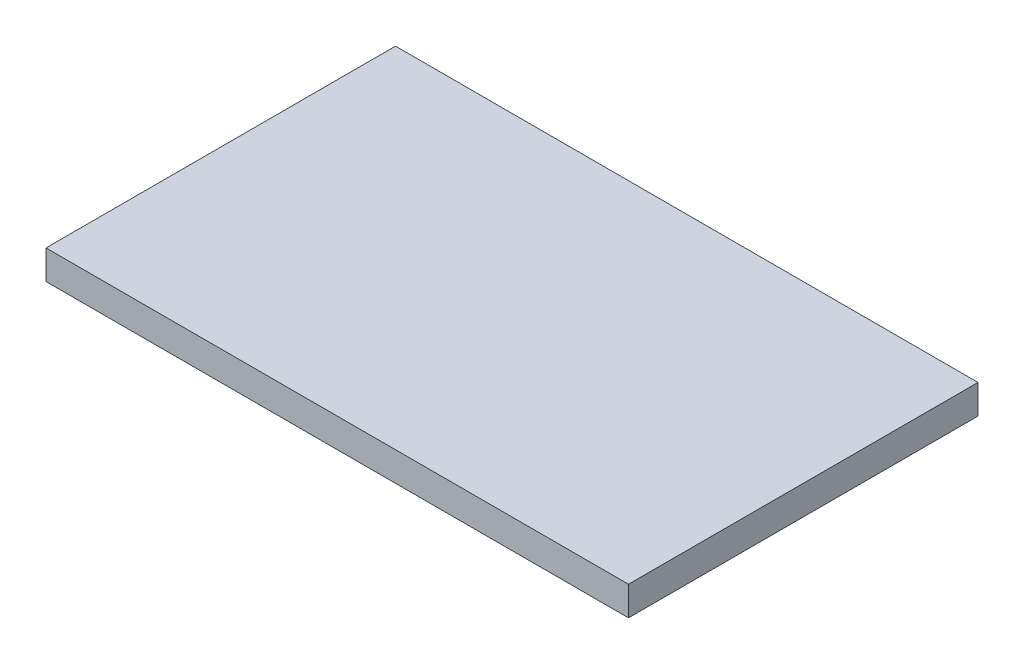
ISO-10303-21;
HEADER;
FILE_DESCRIPTION(('STEP AP214'),'2;1');
FILE_NAME('part.step','',(''),(''),'','','');
FILE_SCHEMA(('AUTOMOTIVE_DESIGN { 1 0 10303 214 1 1 1 1 }'));
ENDSEC;
DATA;
#1=APPLICATION_CONTEXT('core data for automotive mechanical design processes');
#2=APPLICATION_PROTOCOL_DEFINITION('international standard','automotive_design',2000,#1);
#3=PRODUCT_CONTEXT('',#1,'mechanical');
#4=PRODUCT('Part','Part','',(#3));
#5=PRODUCT_RELATED_PRODUCT_CATEGORY('part','',(#4));
#6=PRODUCT_DEFINITION_FORMATION('','',#4);
#7=PRODUCT_DEFINITION_CONTEXT('part definition',#1,'design');
#8=PRODUCT_DEFINITION('design','',#6,#7);
#9=PRODUCT_DEFINITION_SHAPE('','',#8);
#10=(LENGTH_UNIT() NAMED_UNIT(*) SI_UNIT(.MILLI.,.METRE.));
#11=(NAMED_UNIT(*) PLANE_ANGLE_UNIT() SI_UNIT($,.RADIAN.));
#12=(NAMED_UNIT(*) SI_UNIT($,.STERADIAN.) SOLID_ANGLE_UNIT());
#13=UNCERTAINTY_MEASURE_WITH_UNIT(LENGTH_MEASURE(1.E-05),#10,'distance_accuracy_value','');
#14=(GEOMETRIC_REPRESENTATION_CONTEXT(3) GLOBAL_UNCERTAINTY_ASSIGNED_CONTEXT((#13)) GLOBAL_UNIT_ASSIGNED_CONTEXT((#10,
#11,#12)) REPRESENTATION_CONTEXT('',''));
#15=CARTESIAN_POINT('',(0.,0.,0.));
#16=DIRECTION('',(0.,0.,1.));
#17=DIRECTION('',(1.,0.,0.));
#18=AXIS2_PLACEMENT_3D('',#15,#16,#17);
#19=CARTESIAN_POINT('',(254.,25.4,152.4));
#20=DIRECTION('',(-1.,0.,0.));
#21=DIRECTION('',(0.,0.,1.));
#22=AXIS2_PLACEMENT_3D('',#19,#20,#21);
#23=PLANE('',#22);
#24=DIRECTION('',(0.,0.,-1.));
#25=VECTOR('',#24,1.);
#26=CARTESIAN_POINT('',(254.,0.,152.4));
#27=LINE('',#26,#25);
#28=CARTESIAN_POINT('',(254.,0.,152.4));
#29=VERTEX_POINT('',#28);
#30=CARTESIAN_POINT('',(254.,0.,-152.4));
#31=VERTEX_POINT('',#30);
#32=EDGE_CURVE('E96',#29,#31,#27,.T.);
#33=ORIENTED_EDGE('',*,*,#32,.T.);
#34=DIRECTION('',(0.,-1.,0.));
#35=VECTOR('',#34,1.);
#36=CARTESIAN_POINT('',(254.,25.4,-152.4));
#37=LINE('',#36,#35);
#38=CARTESIAN_POINT('',(254.,25.4,-152.4));
#39=VERTEX_POINT('',#38);
#40=EDGE_CURVE('E11',#39,#31,#37,.T.);
#41=ORIENTED_EDGE('',*,*,#40,.F.);
#42=DIRECTION('',(0.,0.,-1.));
#43=VECTOR('',#42,1.);
#44=CARTESIAN_POINT('',(254.,25.4,152.4));
#45=LINE('',#44,#43);
#46=CARTESIAN_POINT('',(254.,25.4,152.4));
#47=VERTEX_POINT('',#46);
#48=EDGE_CURVE('E84',#47,#39,#45,.T.);
#49=ORIENTED_EDGE('',*,*,#48,.F.);
#50=DIRECTION('',(0.,-1.,0.));
#51=VECTOR('',#50,1.);
#52=CARTESIAN_POINT('',(254.,25.4,152.4));
#53=LINE('',#52,#51);
#54=EDGE_CURVE('E92',#47,#29,#53,.T.);
#55=ORIENTED_EDGE('',*,*,#54,.T.);
#56=EDGE_LOOP('',(#33,#41,#49,#55));
#57=FACE_BOUND('',#56,.T.);
#58=ADVANCED_FACE('F33',(#57),#23,.F.);
#59=CARTESIAN_POINT('',(-254.,25.4,-152.4));
#60=DIRECTION('',(0.,0.,1.));
#61=DIRECTION('',(1.,0.,0.));
#62=AXIS2_PLACEMENT_3D('',#59,#60,#61);
#63=PLANE('',#62);
#64=DIRECTION('',(-1.,0.,0.));
#65=VECTOR('',#64,1.);
#66=CARTESIAN_POINT('',(-254.,0.,-152.4));
#67=LINE('',#66,#65);
#68=CARTESIAN_POINT('',(-254.,0.,-152.4));
#69=VERTEX_POINT('',#68);
#70=EDGE_CURVE('E88',#31,#69,#67,.T.);
#71=ORIENTED_EDGE('',*,*,#70,.T.);
#72=DIRECTION('',(0.,-1.,0.));
#73=VECTOR('',#72,1.);
#74=CARTESIAN_POINT('',(-254.,25.4,-152.4));
#75=LINE('',#74,#73);
#76=CARTESIAN_POINT('',(-254.,25.4,-152.4));
#77=VERTEX_POINT('',#76);
#78=EDGE_CURVE('E41',#77,#69,#75,.T.);
#79=ORIENTED_EDGE('',*,*,#78,.F.);
#80=DIRECTION('',(-1.,0.,0.));
#81=VECTOR('',#80,1.);
#82=CARTESIAN_POINT('',(-254.,25.4,-152.4));
#83=LINE('',#82,#81);
#84=EDGE_CURVE('E79',#39,#77,#83,.T.);
#85=ORIENTED_EDGE('',*,*,#84,.F.);
#86=ORIENTED_EDGE('',*,*,#40,.T.);
#87=EDGE_LOOP('',(#71,#79,#85,#86));
#88=FACE_BOUND('',#87,.T.);
#89=ADVANCED_FACE('F87',(#88),#63,.F.);
#90=CARTESIAN_POINT('',(-254.,25.4,152.4));
#91=DIRECTION('',(1.,0.,0.));
#92=DIRECTION('',(0.,0.,-1.));
#93=AXIS2_PLACEMENT_3D('',#90,#91,#92);
#94=PLANE('',#93);
#95=DIRECTION('',(0.,0.,1.));
#96=VECTOR('',#95,1.);
#97=CARTESIAN_POINT('',(-254.,0.,152.4));
#98=LINE('',#97,#96);
#99=CARTESIAN_POINT('',(-254.,0.,152.4));
#100=VERTEX_POINT('',#99);
#101=EDGE_CURVE('E66',#69,#100,#98,.T.);
#102=ORIENTED_EDGE('',*,*,#101,.T.);
#103=DIRECTION('',(0.,-1.,0.));
#104=VECTOR('',#103,1.);
#105=CARTESIAN_POINT('',(-254.,25.4,152.4));
#106=LINE('',#105,#104);
#107=CARTESIAN_POINT('',(-254.,25.4,152.4));
#108=VERTEX_POINT('',#107);
#109=EDGE_CURVE('E89',#108,#100,#106,.T.);
#110=ORIENTED_EDGE('',*,*,#109,.F.);
#111=DIRECTION('',(0.,0.,1.));
#112=VECTOR('',#111,1.);
#113=CARTESIAN_POINT('',(-254.,25.4,152.4));
#114=LINE('',#113,#112);
#115=EDGE_CURVE('E82',#77,#108,#114,.T.);
#116=ORIENTED_EDGE('',*,*,#115,.F.);
#117=ORIENTED_EDGE('',*,*,#78,.T.);
#118=EDGE_LOOP('',(#102,#110,#116,#117));
#119=FACE_BOUND('',#118,.T.);
#120=ADVANCED_FACE('F90',(#119),#94,.F.);
#121=CARTESIAN_POINT('',(-254.,25.4,152.4));
#122=DIRECTION('',(0.,0.,-1.));
#123=DIRECTION('',(-1.,0.,0.));
#124=AXIS2_PLACEMENT_3D('',#121,#122,#123);
#125=PLANE('',#124);
#126=DIRECTION('',(1.,0.,0.));
#127=VECTOR('',#126,1.);
#128=CARTESIAN_POINT('',(-254.,0.,152.4));
#129=LINE('',#128,#127);
#130=EDGE_CURVE('E72',#100,#29,#129,.T.);
#131=ORIENTED_EDGE('',*,*,#130,.T.);
#132=ORIENTED_EDGE('',*,*,#54,.F.);
#133=DIRECTION('',(1.,0.,0.));
#134=VECTOR('',#133,1.);
#135=CARTESIAN_POINT('',(-254.,25.4,152.4));
#136=LINE('',#135,#134);
#137=EDGE_CURVE('E49',#108,#47,#136,.T.);
#138=ORIENTED_EDGE('',*,*,#137,.F.);
#139=ORIENTED_EDGE('',*,*,#109,.T.);
#140=EDGE_LOOP('',(#131,#132,#138,#139));
#141=FACE_BOUND('',#140,.T.);
#142=ADVANCED_FACE('F103',(#141),#125,.F.);
#143=CARTESIAN_POINT('',(0.,25.4,0.));
#144=DIRECTION('',(0.,-1.,0.));
#145=DIRECTION('',(0.,0.,-1.));
#146=AXIS2_PLACEMENT_3D('',#143,#144,#145);
#147=PLANE('',#146);
#148=ORIENTED_EDGE('',*,*,#48,.T.);
#149=ORIENTED_EDGE('',*,*,#84,.T.);
#150=ORIENTED_EDGE('',*,*,#115,.T.);
#151=ORIENTED_EDGE('',*,*,#137,.T.);
#152=EDGE_LOOP('',(#148,#149,#150,#151));
#153=FACE_BOUND('',#152,.T.);
#154=ADVANCED_FACE('F80',(#153),#147,.F.);
#155=CARTESIAN_POINT('',(0.,0.,0.));
#156=DIRECTION('',(0.,-1.,0.));
#157=DIRECTION('',(0.,0.,-1.));
#158=AXIS2_PLACEMENT_3D('',#155,#156,#157);
#159=PLANE('',#158);
#160=ORIENTED_EDGE('',*,*,#32,.F.);
#161=ORIENTED_EDGE('',*,*,#130,.F.);
#162=ORIENTED_EDGE('',*,*,#101,.F.);
#163=ORIENTED_EDGE('',*,*,#70,.F.);
#164=EDGE_LOOP('',(#160,#161,#162,#163));
#165=FACE_BOUND('',#164,.T.);
#166=ADVANCED_FACE('F106',(#165),#159,.T.);
#167=CLOSED_SHELL('',(#58,#89,#120,#142,#154,#166));
#168=MANIFOLD_SOLID_BREP('B2',#167);
#169=ADVANCED_BREP_SHAPE_REPRESENTATION('',(#18,#168),#14);
#170=SHAPE_DEFINITION_REPRESENTATION(#9,#169);
ENDSEC;
END-ISO-10303-21;
